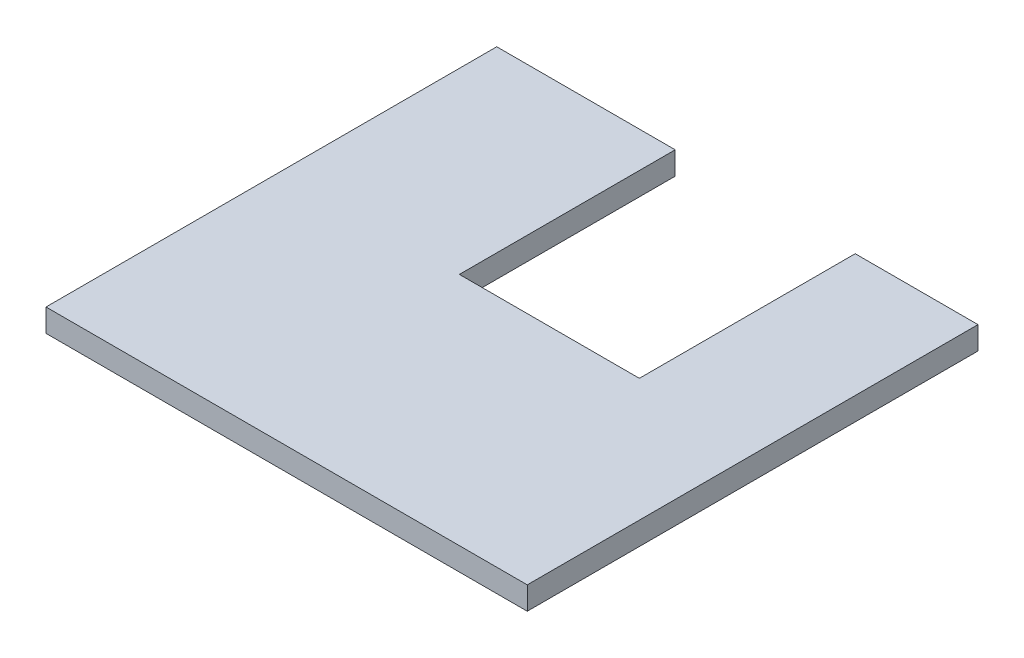
ISO-10303-21;
HEADER;
FILE_DESCRIPTION(('STEP AP214'),'2;1');
FILE_NAME('part.step','',(''),(''),'','','');
FILE_SCHEMA(('AUTOMOTIVE_DESIGN { 1 0 10303 214 1 1 1 1 }'));
ENDSEC;
DATA;
#1=APPLICATION_CONTEXT('core data for automotive mechanical design processes');
#2=APPLICATION_PROTOCOL_DEFINITION('international standard','automotive_design',2000,#1);
#3=PRODUCT_CONTEXT('',#1,'mechanical');
#4=PRODUCT('Part','Part','',(#3));
#5=PRODUCT_RELATED_PRODUCT_CATEGORY('part','',(#4));
#6=PRODUCT_DEFINITION_FORMATION('','',#4);
#7=PRODUCT_DEFINITION_CONTEXT('part definition',#1,'design');
#8=PRODUCT_DEFINITION('design','',#6,#7);
#9=PRODUCT_DEFINITION_SHAPE('','',#8);
#10=(LENGTH_UNIT() NAMED_UNIT(*) SI_UNIT(.MILLI.,.METRE.));
#11=(NAMED_UNIT(*) PLANE_ANGLE_UNIT() SI_UNIT($,.RADIAN.));
#12=(NAMED_UNIT(*) SI_UNIT($,.STERADIAN.) SOLID_ANGLE_UNIT());
#13=UNCERTAINTY_MEASURE_WITH_UNIT(LENGTH_MEASURE(1.E-05),#10,'distance_accuracy_value','');
#14=(GEOMETRIC_REPRESENTATION_CONTEXT(3) GLOBAL_UNCERTAINTY_ASSIGNED_CONTEXT((#13)) GLOBAL_UNIT_ASSIGNED_CONTEXT((#10,
#11,#12)) REPRESENTATION_CONTEXT('',''));
#15=CARTESIAN_POINT('',(0.,0.,0.));
#16=DIRECTION('',(0.,0.,1.));
#17=DIRECTION('',(1.,0.,0.));
#18=AXIS2_PLACEMENT_3D('',#15,#16,#17);
#19=CARTESIAN_POINT('',(-23.4,3.,-28.3));
#20=DIRECTION('',(0.,0.,-1.));
#21=DIRECTION('',(-1.,0.,0.));
#22=AXIS2_PLACEMENT_3D('',#19,#20,#21);
#23=PLANE('',#22);
#24=DIRECTION('',(1.,0.,0.));
#25=VECTOR('',#24,1.);
#26=CARTESIAN_POINT('',(-23.4,0.,-28.3));
#27=LINE('',#26,#25);
#28=CARTESIAN_POINT('',(23.6,0.,-28.3));
#29=VERTEX_POINT('',#28);
#30=CARTESIAN_POINT('',(39.7,0.,-28.3));
#31=VERTEX_POINT('',#30);
#32=EDGE_CURVE('E151',#29,#31,#27,.T.);
#33=ORIENTED_EDGE('',*,*,#32,.F.);
#34=DIRECTION('',(0.,-1.,0.));
#35=VECTOR('',#34,1.);
#36=CARTESIAN_POINT('',(23.6,3.,-28.3));
#37=LINE('',#36,#35);
#38=CARTESIAN_POINT('',(23.6,3.,-28.3));
#39=VERTEX_POINT('',#38);
#40=EDGE_CURVE('E80',#39,#29,#37,.T.);
#41=ORIENTED_EDGE('',*,*,#40,.F.);
#42=DIRECTION('',(1.,0.,0.));
#43=VECTOR('',#42,1.);
#44=CARTESIAN_POINT('',(-23.4,3.,-28.3));
#45=LINE('',#44,#43);
#46=CARTESIAN_POINT('',(39.7,3.,-28.3));
#47=VERTEX_POINT('',#46);
#48=EDGE_CURVE('E149',#39,#47,#45,.T.);
#49=ORIENTED_EDGE('',*,*,#48,.T.);
#50=DIRECTION('',(0.,-1.,0.));
#51=VECTOR('',#50,1.);
#52=CARTESIAN_POINT('',(39.7,3.,-28.3));
#53=LINE('',#52,#51);
#54=EDGE_CURVE('E73',#47,#31,#53,.T.);
#55=ORIENTED_EDGE('',*,*,#54,.T.);
#56=EDGE_LOOP('',(#33,#41,#49,#55));
#57=FACE_BOUND('',#56,.T.);
#58=ADVANCED_FACE('F65',(#57),#23,.T.);
#59=CARTESIAN_POINT('',(-23.4,3.,30.8));
#60=DIRECTION('',(0.,0.,-1.));
#61=DIRECTION('',(-1.,0.,0.));
#62=AXIS2_PLACEMENT_3D('',#59,#60,#61);
#63=PLANE('',#62);
#64=DIRECTION('',(1.,0.,0.));
#65=VECTOR('',#64,1.);
#66=CARTESIAN_POINT('',(-23.4,0.,30.8));
#67=LINE('',#66,#65);
#68=CARTESIAN_POINT('',(-23.4,0.,30.8));
#69=VERTEX_POINT('',#68);
#70=CARTESIAN_POINT('',(39.7,0.,30.8));
#71=VERTEX_POINT('',#70);
#72=EDGE_CURVE('E165',#69,#71,#67,.T.);
#73=ORIENTED_EDGE('',*,*,#72,.T.);
#74=DIRECTION('',(0.,-1.,0.));
#75=VECTOR('',#74,1.);
#76=CARTESIAN_POINT('',(39.7,3.,30.8));
#77=LINE('',#76,#75);
#78=CARTESIAN_POINT('',(39.7,3.,30.8));
#79=VERTEX_POINT('',#78);
#80=EDGE_CURVE('E12',#79,#71,#77,.T.);
#81=ORIENTED_EDGE('',*,*,#80,.F.);
#82=DIRECTION('',(1.,0.,0.));
#83=VECTOR('',#82,1.);
#84=CARTESIAN_POINT('',(-23.4,3.,30.8));
#85=LINE('',#84,#83);
#86=CARTESIAN_POINT('',(-23.4,3.,30.8));
#87=VERTEX_POINT('',#86);
#88=EDGE_CURVE('E114',#87,#79,#85,.T.);
#89=ORIENTED_EDGE('',*,*,#88,.F.);
#90=DIRECTION('',(0.,-1.,0.));
#91=VECTOR('',#90,1.);
#92=CARTESIAN_POINT('',(-23.4,3.,30.8));
#93=LINE('',#92,#91);
#94=EDGE_CURVE('E164',#87,#69,#93,.T.);
#95=ORIENTED_EDGE('',*,*,#94,.T.);
#96=EDGE_LOOP('',(#73,#81,#89,#95));
#97=FACE_BOUND('',#96,.T.);
#98=ADVANCED_FACE('F67',(#97),#63,.F.);
#99=CARTESIAN_POINT('',(39.7,3.,-28.3));
#100=DIRECTION('',(1.,0.,0.));
#101=DIRECTION('',(0.,0.,-1.));
#102=AXIS2_PLACEMENT_3D('',#99,#100,#101);
#103=PLANE('',#102);
#104=DIRECTION('',(0.,0.,1.));
#105=VECTOR('',#104,1.);
#106=CARTESIAN_POINT('',(39.7,0.,-28.3));
#107=LINE('',#106,#105);
#108=EDGE_CURVE('E168',#31,#71,#107,.T.);
#109=ORIENTED_EDGE('',*,*,#108,.F.);
#110=ORIENTED_EDGE('',*,*,#54,.F.);
#111=DIRECTION('',(0.,0.,1.));
#112=VECTOR('',#111,1.);
#113=CARTESIAN_POINT('',(39.7,3.,-28.3));
#114=LINE('',#113,#112);
#115=EDGE_CURVE('E156',#47,#79,#114,.T.);
#116=ORIENTED_EDGE('',*,*,#115,.T.);
#117=ORIENTED_EDGE('',*,*,#80,.T.);
#118=EDGE_LOOP('',(#109,#110,#116,#117));
#119=FACE_BOUND('',#118,.T.);
#120=ADVANCED_FACE('F180',(#119),#103,.T.);
#121=DIRECTION('',(0.,-1.,0.));
#122=VECTOR('',#121,1.);
#123=CARTESIAN_POINT('',(0.,3.,-28.3));
#124=LINE('',#123,#122);
#125=CARTESIAN_POINT('',(0.,3.,-28.3));
#126=VERTEX_POINT('',#125);
#127=CARTESIAN_POINT('',(0.,0.,-28.3));
#128=VERTEX_POINT('',#127);
#129=EDGE_CURVE('E169',#126,#128,#124,.T.);
#130=ORIENTED_EDGE('',*,*,#129,.T.);
#131=CARTESIAN_POINT('',(-23.4,0.,-28.3));
#132=VERTEX_POINT('',#131);
#133=EDGE_CURVE('E172',#132,#128,#27,.T.);
#134=ORIENTED_EDGE('',*,*,#133,.F.);
#135=DIRECTION('',(0.,-1.,0.));
#136=VECTOR('',#135,1.);
#137=CARTESIAN_POINT('',(-23.4,3.,-28.3));
#138=LINE('',#137,#136);
#139=CARTESIAN_POINT('',(-23.4,3.,-28.3));
#140=VERTEX_POINT('',#139);
#141=EDGE_CURVE('E177',#140,#132,#138,.T.);
#142=ORIENTED_EDGE('',*,*,#141,.F.);
#143=EDGE_CURVE('E157',#140,#126,#45,.T.);
#144=ORIENTED_EDGE('',*,*,#143,.T.);
#145=EDGE_LOOP('',(#130,#134,#142,#144));
#146=FACE_BOUND('',#145,.T.);
#147=ADVANCED_FACE('F205',(#146),#23,.T.);
#148=CARTESIAN_POINT('',(-23.4,3.,-28.3));
#149=DIRECTION('',(1.,0.,0.));
#150=DIRECTION('',(0.,0.,-1.));
#151=AXIS2_PLACEMENT_3D('',#148,#149,#150);
#152=PLANE('',#151);
#153=DIRECTION('',(0.,0.,1.));
#154=VECTOR('',#153,1.);
#155=CARTESIAN_POINT('',(-23.4,0.,-28.3));
#156=LINE('',#155,#154);
#157=EDGE_CURVE('E109',#132,#69,#156,.T.);
#158=ORIENTED_EDGE('',*,*,#157,.T.);
#159=ORIENTED_EDGE('',*,*,#94,.F.);
#160=DIRECTION('',(0.,0.,1.));
#161=VECTOR('',#160,1.);
#162=CARTESIAN_POINT('',(-23.4,3.,-28.3));
#163=LINE('',#162,#161);
#164=EDGE_CURVE('E89',#140,#87,#163,.T.);
#165=ORIENTED_EDGE('',*,*,#164,.F.);
#166=ORIENTED_EDGE('',*,*,#141,.T.);
#167=EDGE_LOOP('',(#158,#159,#165,#166));
#168=FACE_BOUND('',#167,.T.);
#169=ADVANCED_FACE('F207',(#168),#152,.F.);
#170=CARTESIAN_POINT('',(0.,3.,0.));
#171=DIRECTION('',(0.,-1.,0.));
#172=DIRECTION('',(0.,0.,-1.));
#173=AXIS2_PLACEMENT_3D('',#170,#171,#172);
#174=PLANE('',#173);
#175=DIRECTION('',(1.,0.,0.));
#176=VECTOR('',#175,1.);
#177=CARTESIAN_POINT('',(0.,3.,0.));
#178=LINE('',#177,#176);
#179=CARTESIAN_POINT('',(0.,3.,0.));
#180=VERTEX_POINT('',#179);
#181=CARTESIAN_POINT('',(23.6,3.,0.));
#182=VERTEX_POINT('',#181);
#183=EDGE_CURVE('E143',#180,#182,#178,.T.);
#184=ORIENTED_EDGE('',*,*,#183,.F.);
#185=DIRECTION('',(0.,0.,-1.));
#186=VECTOR('',#185,1.);
#187=CARTESIAN_POINT('',(0.,3.,0.));
#188=LINE('',#187,#186);
#189=EDGE_CURVE('E152',#180,#126,#188,.T.);
#190=ORIENTED_EDGE('',*,*,#189,.T.);
#191=ORIENTED_EDGE('',*,*,#143,.F.);
#192=ORIENTED_EDGE('',*,*,#164,.T.);
#193=ORIENTED_EDGE('',*,*,#88,.T.);
#194=ORIENTED_EDGE('',*,*,#115,.F.);
#195=ORIENTED_EDGE('',*,*,#48,.F.);
#196=DIRECTION('',(0.,0.,-1.));
#197=VECTOR('',#196,1.);
#198=CARTESIAN_POINT('',(23.6,3.,0.));
#199=LINE('',#198,#197);
#200=EDGE_CURVE('E138',#182,#39,#199,.T.);
#201=ORIENTED_EDGE('',*,*,#200,.F.);
#202=EDGE_LOOP('',(#184,#190,#191,#192,#193,#194,#195,#201));
#203=FACE_BOUND('',#202,.T.);
#204=ADVANCED_FACE('F154',(#203),#174,.F.);
#205=CARTESIAN_POINT('',(0.,0.,0.));
#206=DIRECTION('',(0.,-1.,0.));
#207=DIRECTION('',(0.,0.,-1.));
#208=AXIS2_PLACEMENT_3D('',#205,#206,#207);
#209=PLANE('',#208);
#210=DIRECTION('',(0.,0.,-1.));
#211=VECTOR('',#210,1.);
#212=CARTESIAN_POINT('',(0.,0.,0.));
#213=LINE('',#212,#211);
#214=CARTESIAN_POINT('',(0.,0.,0.));
#215=VERTEX_POINT('',#214);
#216=EDGE_CURVE('E144',#215,#128,#213,.T.);
#217=ORIENTED_EDGE('',*,*,#216,.F.);
#218=DIRECTION('',(1.,0.,0.));
#219=VECTOR('',#218,1.);
#220=CARTESIAN_POINT('',(0.,0.,0.));
#221=LINE('',#220,#219);
#222=CARTESIAN_POINT('',(23.6,0.,0.));
#223=VERTEX_POINT('',#222);
#224=EDGE_CURVE('E188',#215,#223,#221,.T.);
#225=ORIENTED_EDGE('',*,*,#224,.T.);
#226=DIRECTION('',(0.,0.,-1.));
#227=VECTOR('',#226,1.);
#228=CARTESIAN_POINT('',(23.6,0.,0.));
#229=LINE('',#228,#227);
#230=EDGE_CURVE('E186',#223,#29,#229,.T.);
#231=ORIENTED_EDGE('',*,*,#230,.T.);
#232=ORIENTED_EDGE('',*,*,#32,.T.);
#233=ORIENTED_EDGE('',*,*,#108,.T.);
#234=ORIENTED_EDGE('',*,*,#72,.F.);
#235=ORIENTED_EDGE('',*,*,#157,.F.);
#236=ORIENTED_EDGE('',*,*,#133,.T.);
#237=EDGE_LOOP('',(#217,#225,#231,#232,#233,#234,#235,#236));
#238=FACE_BOUND('',#237,.T.);
#239=ADVANCED_FACE('F184',(#238),#209,.T.);
#240=CARTESIAN_POINT('',(0.,3.,0.));
#241=DIRECTION('',(-1.,0.,0.));
#242=DIRECTION('',(0.,0.,1.));
#243=AXIS2_PLACEMENT_3D('',#240,#241,#242);
#244=PLANE('',#243);
#245=ORIENTED_EDGE('',*,*,#216,.T.);
#246=ORIENTED_EDGE('',*,*,#129,.F.);
#247=ORIENTED_EDGE('',*,*,#189,.F.);
#248=DIRECTION('',(0.,-1.,0.));
#249=VECTOR('',#248,1.);
#250=CARTESIAN_POINT('',(0.,3.,0.));
#251=LINE('',#250,#249);
#252=EDGE_CURVE('E197',#180,#215,#251,.T.);
#253=ORIENTED_EDGE('',*,*,#252,.T.);
#254=EDGE_LOOP('',(#245,#246,#247,#253));
#255=FACE_BOUND('',#254,.T.);
#256=ADVANCED_FACE('F228',(#255),#244,.F.);
#257=CARTESIAN_POINT('',(0.,3.,0.));
#258=DIRECTION('',(0.,0.,-1.));
#259=DIRECTION('',(-1.,0.,0.));
#260=AXIS2_PLACEMENT_3D('',#257,#258,#259);
#261=PLANE('',#260);
#262=ORIENTED_EDGE('',*,*,#224,.F.);
#263=ORIENTED_EDGE('',*,*,#252,.F.);
#264=ORIENTED_EDGE('',*,*,#183,.T.);
#265=DIRECTION('',(0.,-1.,0.));
#266=VECTOR('',#265,1.);
#267=CARTESIAN_POINT('',(23.6,3.,0.));
#268=LINE('',#267,#266);
#269=EDGE_CURVE('E140',#182,#223,#268,.T.);
#270=ORIENTED_EDGE('',*,*,#269,.T.);
#271=EDGE_LOOP('',(#262,#263,#264,#270));
#272=FACE_BOUND('',#271,.T.);
#273=ADVANCED_FACE('F200',(#272),#261,.T.);
#274=CARTESIAN_POINT('',(23.6,3.,0.));
#275=DIRECTION('',(-1.,0.,0.));
#276=DIRECTION('',(0.,0.,1.));
#277=AXIS2_PLACEMENT_3D('',#274,#275,#276);
#278=PLANE('',#277);
#279=ORIENTED_EDGE('',*,*,#230,.F.);
#280=ORIENTED_EDGE('',*,*,#269,.F.);
#281=ORIENTED_EDGE('',*,*,#200,.T.);
#282=ORIENTED_EDGE('',*,*,#40,.T.);
#283=EDGE_LOOP('',(#279,#280,#281,#282));
#284=FACE_BOUND('',#283,.T.);
#285=ADVANCED_FACE('F139',(#284),#278,.T.);
#286=CLOSED_SHELL('',(#58,#98,#120,#147,#169,#204,#239,#256,#273,#285));
#287=MANIFOLD_SOLID_BREP('B2',#286);
#288=ADVANCED_BREP_SHAPE_REPRESENTATION('',(#18,#287),#14);
#289=SHAPE_DEFINITION_REPRESENTATION(#9,#288);
ENDSEC;
END-ISO-10303-21;
